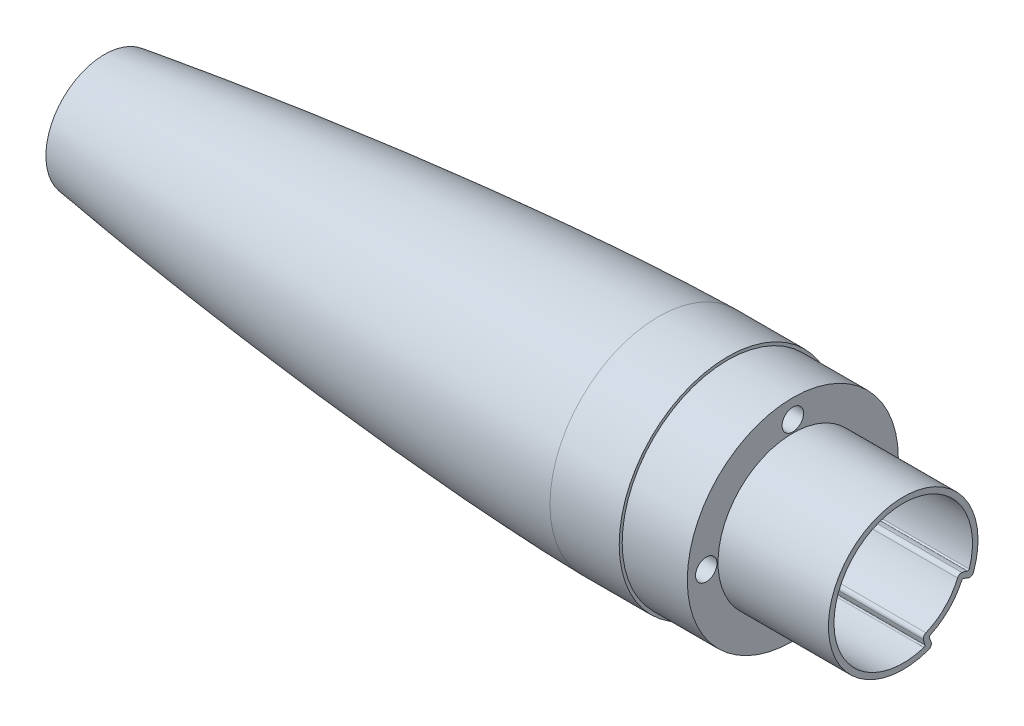
ISO-10303-21;
HEADER;
FILE_DESCRIPTION(('STEP AP214'),'2;1');
FILE_NAME('part.step','',(''),(''),'','','');
FILE_SCHEMA(('AUTOMOTIVE_DESIGN { 1 0 10303 214 1 1 1 1 }'));
ENDSEC;
DATA;
#1=APPLICATION_CONTEXT('core data for automotive mechanical design processes');
#2=APPLICATION_PROTOCOL_DEFINITION('international standard','automotive_design',2000,#1);
#3=PRODUCT_CONTEXT('',#1,'mechanical');
#4=PRODUCT('Part','Part','',(#3));
#5=PRODUCT_RELATED_PRODUCT_CATEGORY('part','',(#4));
#6=PRODUCT_DEFINITION_FORMATION('','',#4);
#7=PRODUCT_DEFINITION_CONTEXT('part definition',#1,'design');
#8=PRODUCT_DEFINITION('design','',#6,#7);
#9=PRODUCT_DEFINITION_SHAPE('','',#8);
#10=(LENGTH_UNIT() NAMED_UNIT(*) SI_UNIT(.MILLI.,.METRE.));
#11=(NAMED_UNIT(*) PLANE_ANGLE_UNIT() SI_UNIT($,.RADIAN.));
#12=(NAMED_UNIT(*) SI_UNIT($,.STERADIAN.) SOLID_ANGLE_UNIT());
#13=UNCERTAINTY_MEASURE_WITH_UNIT(LENGTH_MEASURE(1.E-05),#10,'distance_accuracy_value','');
#14=(GEOMETRIC_REPRESENTATION_CONTEXT(3) GLOBAL_UNCERTAINTY_ASSIGNED_CONTEXT((#13)) GLOBAL_UNIT_ASSIGNED_CONTEXT((#10,
#11,#12)) REPRESENTATION_CONTEXT('',''));
#15=CARTESIAN_POINT('',(0.,0.,0.));
#16=DIRECTION('',(0.,0.,1.));
#17=DIRECTION('',(1.,0.,0.));
#18=AXIS2_PLACEMENT_3D('',#15,#16,#17);
#19=CARTESIAN_POINT('',(526.458884211245,0.,0.));
#20=DIRECTION('',(1.,0.,0.));
#21=DIRECTION('',(0.,0.,-1.));
#22=AXIS2_PLACEMENT_3D('',#19,#20,#21);
#23=CYLINDRICAL_SURFACE('',#22,54.);
#24=CARTESIAN_POINT('',(650.,0.,0.));
#25=DIRECTION('',(-1.,0.,0.));
#26=DIRECTION('',(0.,0.,1.));
#27=AXIS2_PLACEMENT_3D('',#24,#25,#26);
#28=CIRCLE('',#27,54.);
#29=CARTESIAN_POINT('',(650.,-21.6673240024241,-49.4623803569337));
#30=VERTEX_POINT('',#29);
#31=CARTESIAN_POINT('',(650.,-49.4623803569334,-21.6673240024246));
#32=VERTEX_POINT('',#31);
#33=EDGE_CURVE('E172',#30,#32,#28,.T.);
#34=ORIENTED_EDGE('',*,*,#33,.T.);
#35=DIRECTION('',(1.,0.,0.));
#36=VECTOR('',#35,1.);
#37=CARTESIAN_POINT('',(526.458884211245,-49.4623803569334,-21.6673240024246));
#38=LINE('',#37,#36);
#39=CARTESIAN_POINT('',(697.,-49.4623803569334,-21.6673240024246));
#40=VERTEX_POINT('',#39);
#41=EDGE_CURVE('E180',#32,#40,#38,.T.);
#42=ORIENTED_EDGE('',*,*,#41,.T.);
#43=CARTESIAN_POINT('',(697.,0.,0.));
#44=DIRECTION('',(1.,0.,0.));
#45=DIRECTION('',(0.,0.,-1.));
#46=AXIS2_PLACEMENT_3D('',#43,#44,#45);
#47=CIRCLE('',#46,54.);
#48=CARTESIAN_POINT('',(697.,-21.6673240024241,-49.4623803569337));
#49=VERTEX_POINT('',#48);
#50=EDGE_CURVE('E419',#40,#49,#47,.T.);
#51=ORIENTED_EDGE('',*,*,#50,.T.);
#52=DIRECTION('',(1.,0.,0.));
#53=VECTOR('',#52,1.);
#54=CARTESIAN_POINT('',(526.458884211245,-21.6673240024241,-49.4623803569337));
#55=LINE('',#54,#53);
#56=EDGE_CURVE('E182',#30,#49,#55,.T.);
#57=ORIENTED_EDGE('',*,*,#56,.F.);
#58=EDGE_LOOP('',(#34,#42,#51,#57));
#59=FACE_BOUND('',#58,.T.);
#60=ADVANCED_FACE('F44',(#59),#23,.F.);
#61=CARTESIAN_POINT('',(776.72,0.,0.));
#62=DIRECTION('',(-1.,0.,0.));
#63=DIRECTION('',(0.,0.,1.));
#64=AXIS2_PLACEMENT_3D('',#61,#62,#63);
#65=PLANE('',#64);
#66=CARTESIAN_POINT('',(776.72,0.,0.));
#67=DIRECTION('',(1.,0.,0.));
#68=DIRECTION('',(0.,0.,-1.));
#69=AXIS2_PLACEMENT_3D('',#66,#67,#68);
#70=CIRCLE('',#69,54.);
#71=CARTESIAN_POINT('',(776.72,-18.3832569477305,-50.774559220083));
#72=VERTEX_POINT('',#71);
#73=CARTESIAN_POINT('',(776.72,-50.7745592200828,-18.3832569477311));
#74=VERTEX_POINT('',#73);
#75=EDGE_CURVE('E493',#72,#74,#70,.T.);
#76=ORIENTED_EDGE('',*,*,#75,.T.);
#77=CARTESIAN_POINT('',(776.72,-47.9537503745227,-17.3619648950793));
#78=DIRECTION('',(-1.,0.,0.));
#79=DIRECTION('',(0.,0.,1.));
#80=AXIS2_PLACEMENT_3D('',#77,#78,#79);
#81=CIRCLE('',#80,3.);
#82=CARTESIAN_POINT('',(776.72,-46.679404610551,-20.0778520197308));
#83=VERTEX_POINT('',#82);
#84=EDGE_CURVE('E426',#74,#83,#81,.F.);
#85=ORIENTED_EDGE('',*,*,#84,.T.);
#86=CARTESIAN_POINT('',(776.72,-38.1837661840734,-38.1837661840738));
#87=DIRECTION('',(1.,0.,0.));
#88=DIRECTION('',(0.,0.,-1.));
#89=AXIS2_PLACEMENT_3D('',#86,#87,#88);
#90=CIRCLE('',#89,20.);
#91=CARTESIAN_POINT('',(776.72,-43.4171482078619,-18.8806132656232));
#92=VERTEX_POINT('',#91);
#93=EDGE_CURVE('E484',#92,#83,#90,.T.);
#94=ORIENTED_EDGE('',*,*,#93,.F.);
#95=CARTESIAN_POINT('',(776.72,-43.1554791066725,-19.8457709115457));
#96=DIRECTION('',(-1.,0.,0.));
#97=DIRECTION('',(0.,0.,1.));
#98=AXIS2_PLACEMENT_3D('',#95,#96,#97);
#99=CIRCLE('',#98,1.);
#100=CARTESIAN_POINT('',(776.72,-42.2469427044268,-19.4279652081448));
#101=VERTEX_POINT('',#100);
#102=EDGE_CURVE('E14',#92,#101,#99,.T.);
#103=ORIENTED_EDGE('',*,*,#102,.T.);
#104=CARTESIAN_POINT('',(776.72,0.,0.));
#105=DIRECTION('',(1.,0.,0.));
#106=DIRECTION('',(0.,0.,-1.));
#107=AXIS2_PLACEMENT_3D('',#104,#105,#106);
#108=CIRCLE('',#107,46.5);
#109=CARTESIAN_POINT('',(776.72,-19.4279652081443,-42.2469427044269));
#110=VERTEX_POINT('',#109);
#111=EDGE_CURVE('E190',#101,#110,#108,.T.);
#112=ORIENTED_EDGE('',*,*,#111,.T.);
#113=CARTESIAN_POINT('',(776.72,-19.8457709115453,-43.1554791066727));
#114=DIRECTION('',(-1.,0.,0.));
#115=DIRECTION('',(0.,0.,1.));
#116=AXIS2_PLACEMENT_3D('',#113,#114,#115);
#117=CIRCLE('',#116,1.);
#118=CARTESIAN_POINT('',(776.72,-18.8806132656227,-43.4171482078621));
#119=VERTEX_POINT('',#118);
#120=EDGE_CURVE('E52',#110,#119,#117,.T.);
#121=ORIENTED_EDGE('',*,*,#120,.T.);
#122=CARTESIAN_POINT('',(776.72,-20.0778520197303,-46.6794046105512));
#123=VERTEX_POINT('',#122);
#124=EDGE_CURVE('E192',#123,#119,#90,.T.);
#125=ORIENTED_EDGE('',*,*,#124,.F.);
#126=CARTESIAN_POINT('',(776.72,-17.3619648950788,-47.9537503745229));
#127=DIRECTION('',(-1.,0.,0.));
#128=DIRECTION('',(0.,0.,1.));
#129=AXIS2_PLACEMENT_3D('',#126,#127,#128);
#130=CIRCLE('',#129,3.);
#131=EDGE_CURVE('E495',#123,#72,#130,.F.);
#132=ORIENTED_EDGE('',*,*,#131,.T.);
#133=EDGE_LOOP('',(#76,#85,#94,#103,#112,#121,#125,#132));
#134=FACE_BOUND('',#133,.T.);
#135=CARTESIAN_POINT('',(776.72,0.,0.));
#136=DIRECTION('',(1.,0.,0.));
#137=DIRECTION('',(0.,0.,-1.));
#138=AXIS2_PLACEMENT_3D('',#135,#136,#137);
#139=CIRCLE('',#138,42.5);
#140=CARTESIAN_POINT('',(776.72,-39.2186752694362,-16.3751491630005));
#141=VERTEX_POINT('',#140);
#142=CARTESIAN_POINT('',(776.72,-16.3751491630001,-39.2186752694364));
#143=VERTEX_POINT('',#142);
#144=EDGE_CURVE('E253',#141,#143,#139,.T.);
#145=ORIENTED_EDGE('',*,*,#144,.F.);
#146=CARTESIAN_POINT('',(776.72,-41.9870523472787,-17.5310420450947));
#147=DIRECTION('',(-1.,0.,0.));
#148=DIRECTION('',(0.,0.,1.));
#149=AXIS2_PLACEMENT_3D('',#146,#147,#148);
#150=CIRCLE('',#149,3.);
#151=CARTESIAN_POINT('',(776.72,-42.5303789420224,-14.5806528823834));
#152=VERTEX_POINT('',#151);
#153=EDGE_CURVE('E497',#141,#152,#150,.F.);
#154=ORIENTED_EDGE('',*,*,#153,.T.);
#155=CARTESIAN_POINT('',(776.72,-38.1837661840734,-38.1837661840738));
#156=DIRECTION('',(1.,0.,0.));
#157=DIRECTION('',(0.,0.,-1.));
#158=AXIS2_PLACEMENT_3D('',#155,#156,#157);
#159=CIRCLE('',#158,24.);
#160=CARTESIAN_POINT('',(776.72,-46.4021029100295,-15.6347320260704));
#161=VERTEX_POINT('',#160);
#162=EDGE_CURVE('E236',#152,#161,#159,.T.);
#163=ORIENTED_EDGE('',*,*,#162,.T.);
#164=CARTESIAN_POINT('',(776.72,-46.7445336069443,-14.6951889361536));
#165=DIRECTION('',(-1.,0.,0.));
#166=DIRECTION('',(0.,0.,1.));
#167=AXIS2_PLACEMENT_3D('',#164,#165,#166);
#168=CIRCLE('',#167,1.);
#169=CARTESIAN_POINT('',(776.72,-47.6985036805554,-14.9950907511772));
#170=VERTEX_POINT('',#169);
#171=EDGE_CURVE('E477',#161,#170,#168,.T.);
#172=ORIENTED_EDGE('',*,*,#171,.T.);
#173=CARTESIAN_POINT('',(776.72,0.,0.));
#174=DIRECTION('',(1.,0.,0.));
#175=DIRECTION('',(0.,0.,-1.));
#176=AXIS2_PLACEMENT_3D('',#173,#174,#175);
#177=CIRCLE('',#176,50.);
#178=CARTESIAN_POINT('',(776.72,-14.9950907511766,-47.6985036805556));
#179=VERTEX_POINT('',#178);
#180=EDGE_CURVE('E243',#179,#170,#177,.T.);
#181=ORIENTED_EDGE('',*,*,#180,.F.);
#182=CARTESIAN_POINT('',(776.72,-14.6951889361531,-46.7445336069445));
#183=DIRECTION('',(-1.,0.,0.));
#184=DIRECTION('',(0.,0.,1.));
#185=AXIS2_PLACEMENT_3D('',#182,#183,#184);
#186=CIRCLE('',#185,1.);
#187=CARTESIAN_POINT('',(776.72,-15.6347320260699,-46.4021029100297));
#188=VERTEX_POINT('',#187);
#189=EDGE_CURVE('E475',#179,#188,#186,.T.);
#190=ORIENTED_EDGE('',*,*,#189,.T.);
#191=CARTESIAN_POINT('',(776.72,-14.5806528823829,-42.5303789420225));
#192=VERTEX_POINT('',#191);
#193=EDGE_CURVE('E254',#188,#192,#159,.T.);
#194=ORIENTED_EDGE('',*,*,#193,.T.);
#195=CARTESIAN_POINT('',(776.72,-17.5310420450942,-41.9870523472789));
#196=DIRECTION('',(-1.,0.,0.));
#197=DIRECTION('',(0.,0.,1.));
#198=AXIS2_PLACEMENT_3D('',#195,#196,#197);
#199=CIRCLE('',#198,3.);
#200=EDGE_CURVE('E494',#192,#143,#199,.F.);
#201=ORIENTED_EDGE('',*,*,#200,.T.);
#202=EDGE_LOOP('',(#145,#154,#163,#172,#181,#190,#194,#201));
#203=FACE_BOUND('',#202,.T.);
#204=ADVANCED_FACE('F273',(#134,#203),#65,.F.);
#205=CARTESIAN_POINT('',(0.,0.,0.));
#206=CARTESIAN_POINT('',(0.0016487257899739,0.00637767165344409,0.));
#207=CARTESIAN_POINT('',(0.0057621718653015,0.0188021593914274,0.));
#208=CARTESIAN_POINT('',(0.0175123313243743,0.0422493817570645,0.));
#209=CARTESIAN_POINT('',(0.046253840596632,0.0861642592508907,0.));
#210=CARTESIAN_POINT('',(0.0914748777391001,0.142292386652359,0.));
#211=CARTESIAN_POINT('',(0.154274348482774,0.20912514537751,0.));
#212=CARTESIAN_POINT('',(0.276301441633623,0.324701770965458,0.));
#213=CARTESIAN_POINT('',(0.421122579930573,0.443291574190418,0.));
#214=CARTESIAN_POINT('',(0.586286455480629,0.566464418607899,0.));
#215=CARTESIAN_POINT('',(0.83951343193514,0.741034702086761,0.));
#216=CARTESIAN_POINT('',(1.18296840036321,0.960203667032714,0.));
#217=CARTESIAN_POINT('',(1.78280966033623,1.30866238394851,0.));
#218=CARTESIAN_POINT('',(2.86829695281267,1.87162382715185,0.));
#219=CARTESIAN_POINT('',(4.76277782522134,2.73974077748204,0.));
#220=CARTESIAN_POINT('',(8.19028565992219,4.11595910205271,0.));
#221=CARTESIAN_POINT('',(14.422968110472,6.28797056713511,0.));
#222=CARTESIAN_POINT('',(24.8043027546662,9.40768115367406,0.));
#223=CARTESIAN_POINT('',(38.8994962833824,13.087626071966,0.));
#224=CARTESIAN_POINT('',(55.9277376029872,17.0568128067629,0.));
#225=CARTESIAN_POINT('',(79.0908104498615,21.9783504080432,0.));
#226=CARTESIAN_POINT('',(106.881185800737,27.3295948783205,0.));
#227=CARTESIAN_POINT('',(139.404169497215,33.0214355719504,0.));
#228=CARTESIAN_POINT('',(176.668348452349,38.9538903494959,0.));
#229=CARTESIAN_POINT('',(214.003857084132,44.4168991341357,0.));
#230=CARTESIAN_POINT('',(251.396751983993,49.471116429039,0.));
#231=CARTESIAN_POINT('',(288.837779512109,54.1545255374062,0.));
#232=CARTESIAN_POINT('',(326.320734140861,58.4892815739677,0.));
#233=CARTESIAN_POINT('',(363.841177132752,62.4863121261995,0.));
#234=CARTESIAN_POINT('',(401.39599420768,66.1465092198773,0.));
#235=CARTESIAN_POINT('',(438.982971251084,69.4606087355129,0.));
#236=CARTESIAN_POINT('',(476.600652970697,72.4071093826599,0.));
#237=CARTESIAN_POINT('',(509.542265690245,74.6286978107565,0.));
#238=CARTESIAN_POINT('',(537.796481138977,76.2335046528282,0.));
#239=CARTESIAN_POINT('',(560.292262180115,77.2754594007759,0.));
#240=CARTESIAN_POINT('',(575.19535670378,77.8326432804356,0.));
#241=CARTESIAN_POINT('',(587.214225045065,78.1730067265653,0.));
#242=CARTESIAN_POINT('',(594.51997618939,78.3103558818441,0.));
#243=CARTESIAN_POINT('',(598.173256760109,78.3543246601118,0.));
#244=CARTESIAN_POINT('',(600.,78.36,0.));
#245=B_SPLINE_CURVE_WITH_KNOTS('',4,(#205,#206,#207,#208,#209,#210,#211,#212,#213,#214,#215,
#216,#217,#218,#219,#220,#221,#222,#223,#224,#225,#226,#227,#228,#229,#230,#231,#232,#233,#234,
#235,#236,#237,#238,#239,#240,#241,#242,#243,#244),.UNSPECIFIED.,.F.,.F.,(5,1,1,1,1,1,1,1,1,1,1,
1,1,1,1,1,1,1,1,1,1,1,1,1,1,1,1,1,1,1,1,1,1,1,1,1,5),(0.,4.31412316187256E-05,
8.62824632374512E-05,0.000172564926474902,0.000345129852949805,0.000517694779424707,
0.000690259705899609,0.00127990506767294,0.00157768305463857,0.0018754610416042,
0.00271726976481212,0.00396472959905857,0.00614862348380284,0.00993227852523749,
0.0164479418553174,0.028301298247299,0.0496396283350756,0.0813631631901833,0.112451510280435,
0.143539857370687,0.20571657333025,0.267893284077703,0.330069994858809,0.392246705900878,
0.454423416608389,0.516600127206857,0.578776840412764,0.640953551735382,0.703130263297214,
0.765306975424274,0.827483686980578,0.889660398581477,0.920748754835595,0.951837111089712,
0.975918555544856,0.987959277772428,1.),.UNSPECIFIED.);
#246=CARTESIAN_POINT('',(776.72,0.,0.));
#247=DIRECTION('',(1.,0.,0.));
#248=AXIS1_PLACEMENT('',#246,#247);
#249=SURFACE_OF_REVOLUTION('',#245,#248);
#250=CARTESIAN_POINT('',(600.,0.,0.));
#251=DIRECTION('',(1.,0.,0.));
#252=DIRECTION('',(0.,0.,-1.));
#253=AXIS2_PLACEMENT_3D('',#250,#251,#252);
#254=CIRCLE('',#253,78.36);
#255=CARTESIAN_POINT('',(600.,0.,-78.36));
#256=VERTEX_POINT('',#255);
#257=EDGE_CURVE('E250',#256,#256,#254,.T.);
#258=ORIENTED_EDGE('',*,*,#257,.F.);
#259=EDGE_LOOP('',(#258));
#260=FACE_BOUND('',#259,.T.);
#261=CARTESIAN_POINT('',(200.000000000004,0.,0.));
#262=DIRECTION('',(1.,0.,0.));
#263=DIRECTION('',(0.,0.,-1.));
#264=AXIS2_PLACEMENT_3D('',#261,#262,#263);
#265=CIRCLE('',#264,42.3282803701014);
#266=CARTESIAN_POINT('',(200.000000000004,0.,-42.3282803701014));
#267=VERTEX_POINT('',#266);
#268=EDGE_CURVE('E519',#267,#267,#265,.T.);
#269=ORIENTED_EDGE('',*,*,#268,.T.);
#270=EDGE_LOOP('',(#269));
#271=FACE_BOUND('',#270,.T.);
#272=ADVANCED_FACE('F268',(#260,#271),#249,.T.);
#273=CARTESIAN_POINT('',(200.000000000003,-1.70487664440081E-11,0.));
#274=DIRECTION('',(1.,0.,0.));
#275=DIRECTION('',(0.,0.,-1.));
#276=AXIS2_PLACEMENT_3D('',#273,#274,#275);
#277=PLANE('',#276);
#278=CARTESIAN_POINT('',(200.000000000003,0.,0.));
#279=DIRECTION('',(-1.,0.,0.));
#280=DIRECTION('',(0.,0.,1.));
#281=AXIS2_PLACEMENT_3D('',#278,#279,#280);
#282=CIRCLE('',#281,33.);
#283=CARTESIAN_POINT('',(200.000000000003,0.,33.));
#284=VERTEX_POINT('',#283);
#285=EDGE_CURVE('E232',#284,#284,#282,.T.);
#286=ORIENTED_EDGE('',*,*,#285,.F.);
#287=EDGE_LOOP('',(#286));
#288=FACE_BOUND('',#287,.T.);
#289=ORIENTED_EDGE('',*,*,#268,.F.);
#290=EDGE_LOOP('',(#289));
#291=FACE_BOUND('',#290,.T.);
#292=ADVANCED_FACE('F272',(#288,#291),#277,.F.);
#293=CARTESIAN_POINT('',(776.72,0.,0.));
#294=DIRECTION('',(1.,0.,0.));
#295=DIRECTION('',(0.,0.,-1.));
#296=AXIS2_PLACEMENT_3D('',#293,#294,#295);
#297=CYLINDRICAL_SURFACE('',#296,54.);
#298=CARTESIAN_POINT('',(697.,-18.3832569477305,-50.774559220083));
#299=VERTEX_POINT('',#298);
#300=CARTESIAN_POINT('',(697.,-50.7745592200828,-18.3832569477311));
#301=VERTEX_POINT('',#300);
#302=EDGE_CURVE('E410',#299,#301,#47,.T.);
#303=ORIENTED_EDGE('',*,*,#302,.T.);
#304=DIRECTION('',(1.,0.,0.));
#305=VECTOR('',#304,1.);
#306=CARTESIAN_POINT('',(776.72,-50.7745592200828,-18.3832569477311));
#307=LINE('',#306,#305);
#308=EDGE_CURVE('E413',#301,#74,#307,.T.);
#309=ORIENTED_EDGE('',*,*,#308,.T.);
#310=ORIENTED_EDGE('',*,*,#75,.F.);
#311=DIRECTION('',(1.,0.,0.));
#312=VECTOR('',#311,1.);
#313=CARTESIAN_POINT('',(776.72,-18.3832569477305,-50.774559220083));
#314=LINE('',#313,#312);
#315=EDGE_CURVE('E416',#72,#299,#314,.F.);
#316=ORIENTED_EDGE('',*,*,#315,.T.);
#317=EDGE_LOOP('',(#303,#309,#310,#316));
#318=FACE_BOUND('',#317,.T.);
#319=ADVANCED_FACE('F399',(#318),#297,.T.);
#320=CARTESIAN_POINT('',(697.,0.,0.));
#321=DIRECTION('',(-1.,0.,0.));
#322=DIRECTION('',(0.,0.,1.));
#323=AXIS2_PLACEMENT_3D('',#320,#321,#322);
#324=PLANE('',#323);
#325=CARTESIAN_POINT('',(697.,62.5,0.));
#326=DIRECTION('',(1.,0.,0.));
#327=DIRECTION('',(0.,0.,-1.));
#328=AXIS2_PLACEMENT_3D('',#325,#326,#327);
#329=CIRCLE('',#328,7.75);
#330=CARTESIAN_POINT('',(697.,62.5,-7.75));
#331=VERTEX_POINT('',#330);
#332=EDGE_CURVE('E200',#331,#331,#329,.T.);
#333=ORIENTED_EDGE('',*,*,#332,.F.);
#334=EDGE_LOOP('',(#333));
#335=FACE_BOUND('',#334,.T.);
#336=CARTESIAN_POINT('',(697.,-2.18249897321332E-13,-62.5));
#337=DIRECTION('',(1.,0.,0.));
#338=DIRECTION('',(0.,0.,-1.));
#339=AXIS2_PLACEMENT_3D('',#336,#337,#338);
#340=CIRCLE('',#339,7.75);
#341=CARTESIAN_POINT('',(697.,-2.18249897321332E-13,-70.25));
#342=VERTEX_POINT('',#341);
#343=EDGE_CURVE('E203',#342,#342,#340,.T.);
#344=ORIENTED_EDGE('',*,*,#343,.F.);
#345=EDGE_LOOP('',(#344));
#346=FACE_BOUND('',#345,.T.);
#347=CARTESIAN_POINT('',(697.,-62.5,4.37150315946155E-13));
#348=DIRECTION('',(1.,0.,0.));
#349=DIRECTION('',(0.,0.,-1.));
#350=AXIS2_PLACEMENT_3D('',#347,#348,#349);
#351=CIRCLE('',#350,7.75);
#352=CARTESIAN_POINT('',(697.,-62.5,-7.74999999999956));
#353=VERTEX_POINT('',#352);
#354=EDGE_CURVE('E209',#353,#353,#351,.T.);
#355=ORIENTED_EDGE('',*,*,#354,.F.);
#356=EDGE_LOOP('',(#355));
#357=FACE_BOUND('',#356,.T.);
#358=CARTESIAN_POINT('',(697.,6.55725473919233E-13,62.5));
#359=DIRECTION('',(1.,0.,0.));
#360=DIRECTION('',(0.,0.,-1.));
#361=AXIS2_PLACEMENT_3D('',#358,#359,#360);
#362=CIRCLE('',#361,7.75);
#363=CARTESIAN_POINT('',(697.,6.55725473919233E-13,54.75));
#364=VERTEX_POINT('',#363);
#365=EDGE_CURVE('E215',#364,#364,#362,.T.);
#366=ORIENTED_EDGE('',*,*,#365,.F.);
#367=EDGE_LOOP('',(#366));
#368=FACE_BOUND('',#367,.T.);
#369=ORIENTED_EDGE('',*,*,#50,.F.);
#370=CARTESIAN_POINT('',(697.,-38.1837661840734,-38.1837661840738));
#371=DIRECTION('',(-1.,0.,0.));
#372=DIRECTION('',(0.,0.,1.));
#373=AXIS2_PLACEMENT_3D('',#370,#371,#372);
#374=CIRCLE('',#373,20.);
#375=CARTESIAN_POINT('',(697.,-46.679404610551,-20.0778520197308));
#376=VERTEX_POINT('',#375);
#377=EDGE_CURVE('E187',#376,#40,#374,.F.);
#378=ORIENTED_EDGE('',*,*,#377,.F.);
#379=CARTESIAN_POINT('',(697.,-47.9537503745227,-17.3619648950793));
#380=DIRECTION('',(-1.,0.,0.));
#381=DIRECTION('',(0.,0.,1.));
#382=AXIS2_PLACEMENT_3D('',#379,#380,#381);
#383=CIRCLE('',#382,3.);
#384=EDGE_CURVE('E424',#376,#301,#383,.T.);
#385=ORIENTED_EDGE('',*,*,#384,.T.);
#386=ORIENTED_EDGE('',*,*,#302,.F.);
#387=CARTESIAN_POINT('',(697.,-17.3619648950788,-47.9537503745229));
#388=DIRECTION('',(-1.,0.,0.));
#389=DIRECTION('',(0.,0.,1.));
#390=AXIS2_PLACEMENT_3D('',#387,#388,#389);
#391=CIRCLE('',#390,3.);
#392=CARTESIAN_POINT('',(697.,-20.0778520197303,-46.6794046105512));
#393=VERTEX_POINT('',#392);
#394=EDGE_CURVE('E447',#299,#393,#391,.T.);
#395=ORIENTED_EDGE('',*,*,#394,.T.);
#396=CARTESIAN_POINT('',(697.,-38.1837661840734,-38.1837661840738));
#397=DIRECTION('',(-1.,0.,0.));
#398=DIRECTION('',(0.,0.,1.));
#399=AXIS2_PLACEMENT_3D('',#396,#397,#398);
#400=CIRCLE('',#399,20.);
#401=EDGE_CURVE('E427',#49,#393,#400,.F.);
#402=ORIENTED_EDGE('',*,*,#401,.F.);
#403=EDGE_LOOP('',(#369,#378,#385,#386,#395,#402));
#404=FACE_BOUND('',#403,.T.);
#405=CARTESIAN_POINT('',(697.,0.,0.));
#406=DIRECTION('',(1.,0.,0.));
#407=DIRECTION('',(0.,0.,-1.));
#408=AXIS2_PLACEMENT_3D('',#405,#406,#407);
#409=CIRCLE('',#408,76.2);
#410=CARTESIAN_POINT('',(697.,0.,-76.2));
#411=VERTEX_POINT('',#410);
#412=EDGE_CURVE('E420',#411,#411,#409,.T.);
#413=ORIENTED_EDGE('',*,*,#412,.T.);
#414=EDGE_LOOP('',(#413));
#415=FACE_BOUND('',#414,.T.);
#416=ADVANCED_FACE('F395',(#335,#346,#357,#368,#404,#415),#324,.F.);
#417=CARTESIAN_POINT('',(776.72,0.,0.));
#418=DIRECTION('',(1.,0.,0.));
#419=DIRECTION('',(0.,0.,-1.));
#420=AXIS2_PLACEMENT_3D('',#417,#418,#419);
#421=CYLINDRICAL_SURFACE('',#420,76.2);
#422=ORIENTED_EDGE('',*,*,#412,.F.);
#423=EDGE_LOOP('',(#422));
#424=FACE_BOUND('',#423,.T.);
#425=CARTESIAN_POINT('',(650.,0.,0.));
#426=DIRECTION('',(1.,0.,0.));
#427=DIRECTION('',(0.,0.,-1.));
#428=AXIS2_PLACEMENT_3D('',#425,#426,#427);
#429=CIRCLE('',#428,76.2);
#430=CARTESIAN_POINT('',(650.,0.,-76.2));
#431=VERTEX_POINT('',#430);
#432=EDGE_CURVE('E527',#431,#431,#429,.T.);
#433=ORIENTED_EDGE('',*,*,#432,.T.);
#434=EDGE_LOOP('',(#433));
#435=FACE_BOUND('',#434,.T.);
#436=ADVANCED_FACE('F391',(#424,#435),#421,.T.);
#437=CARTESIAN_POINT('',(650.,0.,0.));
#438=DIRECTION('',(-1.,0.,0.));
#439=DIRECTION('',(0.,0.,1.));
#440=AXIS2_PLACEMENT_3D('',#437,#438,#439);
#441=PLANE('',#440);
#442=ORIENTED_EDGE('',*,*,#432,.F.);
#443=EDGE_LOOP('',(#442));
#444=FACE_BOUND('',#443,.T.);
#445=CARTESIAN_POINT('',(650.,0.,0.));
#446=DIRECTION('',(1.,0.,0.));
#447=DIRECTION('',(0.,0.,-1.));
#448=AXIS2_PLACEMENT_3D('',#445,#446,#447);
#449=CIRCLE('',#448,78.36);
#450=CARTESIAN_POINT('',(650.,0.,-78.36));
#451=VERTEX_POINT('',#450);
#452=EDGE_CURVE('E529',#451,#451,#449,.T.);
#453=ORIENTED_EDGE('',*,*,#452,.T.);
#454=EDGE_LOOP('',(#453));
#455=FACE_BOUND('',#454,.T.);
#456=ADVANCED_FACE('F387',(#444,#455),#441,.F.);
#457=CARTESIAN_POINT('',(776.72,0.,0.));
#458=DIRECTION('',(1.,0.,0.));
#459=DIRECTION('',(0.,0.,-1.));
#460=AXIS2_PLACEMENT_3D('',#457,#458,#459);
#461=CYLINDRICAL_SURFACE('',#460,78.36);
#462=ORIENTED_EDGE('',*,*,#452,.F.);
#463=EDGE_LOOP('',(#462));
#464=FACE_BOUND('',#463,.T.);
#465=ORIENTED_EDGE('',*,*,#257,.T.);
#466=EDGE_LOOP('',(#465));
#467=FACE_BOUND('',#466,.T.);
#468=ADVANCED_FACE('F384',(#464,#467),#461,.T.);
#469=CARTESIAN_POINT('',(376.72,-38.1837661840734,-38.1837661840738));
#470=DIRECTION('',(1.,0.,0.));
#471=DIRECTION('',(0.,0.,-1.));
#472=AXIS2_PLACEMENT_3D('',#469,#470,#471);
#473=CYLINDRICAL_SURFACE('',#472,24.);
#474=CARTESIAN_POINT('',(376.72,-38.1837661840734,-38.1837661840738));
#475=DIRECTION('',(1.,0.,0.));
#476=DIRECTION('',(0.,0.,-1.));
#477=AXIS2_PLACEMENT_3D('',#474,#475,#476);
#478=CIRCLE('',#477,24.);
#479=CARTESIAN_POINT('',(376.72,-42.5303789420224,-14.5806528823834));
#480=VERTEX_POINT('',#479);
#481=CARTESIAN_POINT('',(376.72,-46.4021029100295,-15.6347320260704));
#482=VERTEX_POINT('',#481);
#483=EDGE_CURVE('E239',#480,#482,#478,.T.);
#484=ORIENTED_EDGE('',*,*,#483,.T.);
#485=DIRECTION('',(1.,0.,0.));
#486=VECTOR('',#485,1.);
#487=CARTESIAN_POINT('',(376.72,-46.4021029100295,-15.6347320260704));
#488=LINE('',#487,#486);
#489=EDGE_CURVE('E460',#482,#161,#488,.T.);
#490=ORIENTED_EDGE('',*,*,#489,.T.);
#491=ORIENTED_EDGE('',*,*,#162,.F.);
#492=DIRECTION('',(1.,0.,0.));
#493=VECTOR('',#492,1.);
#494=CARTESIAN_POINT('',(376.72,-42.5303789420224,-14.5806528823834));
#495=LINE('',#494,#493);
#496=EDGE_CURVE('E504',#152,#480,#495,.F.);
#497=ORIENTED_EDGE('',*,*,#496,.T.);
#498=EDGE_LOOP('',(#484,#490,#491,#497));
#499=FACE_BOUND('',#498,.T.);
#500=ADVANCED_FACE('F376',(#499),#473,.T.);
#501=CARTESIAN_POINT('',(376.72,0.,0.));
#502=DIRECTION('',(1.,0.,0.));
#503=DIRECTION('',(0.,0.,-1.));
#504=AXIS2_PLACEMENT_3D('',#501,#502,#503);
#505=CYLINDRICAL_SURFACE('',#504,50.);
#506=CARTESIAN_POINT('',(376.72,0.,0.));
#507=DIRECTION('',(1.,0.,0.));
#508=DIRECTION('',(0.,0.,-1.));
#509=AXIS2_PLACEMENT_3D('',#506,#507,#508);
#510=CIRCLE('',#509,50.);
#511=CARTESIAN_POINT('',(376.72,-14.9950907511766,-47.6985036805556));
#512=VERTEX_POINT('',#511);
#513=CARTESIAN_POINT('',(376.72,-47.6985036805554,-14.9950907511772));
#514=VERTEX_POINT('',#513);
#515=EDGE_CURVE('E247',#512,#514,#510,.T.);
#516=ORIENTED_EDGE('',*,*,#515,.F.);
#517=DIRECTION('',(1.,0.,0.));
#518=VECTOR('',#517,1.);
#519=CARTESIAN_POINT('',(376.72,-14.9950907511766,-47.6985036805556));
#520=LINE('',#519,#518);
#521=EDGE_CURVE('E451',#512,#179,#520,.T.);
#522=ORIENTED_EDGE('',*,*,#521,.T.);
#523=ORIENTED_EDGE('',*,*,#180,.T.);
#524=DIRECTION('',(1.,0.,0.));
#525=VECTOR('',#524,1.);
#526=CARTESIAN_POINT('',(376.72,-47.6985036805554,-14.9950907511772));
#527=LINE('',#526,#525);
#528=EDGE_CURVE('E449',#170,#514,#527,.F.);
#529=ORIENTED_EDGE('',*,*,#528,.T.);
#530=EDGE_LOOP('',(#516,#522,#523,#529));
#531=FACE_BOUND('',#530,.T.);
#532=ADVANCED_FACE('F372',(#531),#505,.F.);
#533=ORIENTED_EDGE('',*,*,#193,.F.);
#534=DIRECTION('',(1.,0.,0.));
#535=VECTOR('',#534,1.);
#536=CARTESIAN_POINT('',(376.72,-15.6347320260699,-46.4021029100297));
#537=LINE('',#536,#535);
#538=CARTESIAN_POINT('',(376.72,-15.6347320260699,-46.4021029100297));
#539=VERTEX_POINT('',#538);
#540=EDGE_CURVE('E454',#188,#539,#537,.F.);
#541=ORIENTED_EDGE('',*,*,#540,.T.);
#542=CARTESIAN_POINT('',(376.72,-14.5806528823829,-42.5303789420225));
#543=VERTEX_POINT('',#542);
#544=EDGE_CURVE('E244',#539,#543,#478,.T.);
#545=ORIENTED_EDGE('',*,*,#544,.T.);
#546=DIRECTION('',(1.,0.,0.));
#547=VECTOR('',#546,1.);
#548=CARTESIAN_POINT('',(376.72,-14.5806528823829,-42.5303789420225));
#549=LINE('',#548,#547);
#550=EDGE_CURVE('E432',#543,#192,#549,.T.);
#551=ORIENTED_EDGE('',*,*,#550,.T.);
#552=EDGE_LOOP('',(#533,#541,#545,#551));
#553=FACE_BOUND('',#552,.T.);
#554=ADVANCED_FACE('F375',(#553),#473,.T.);
#555=CARTESIAN_POINT('',(376.72,0.,0.));
#556=DIRECTION('',(1.,0.,0.));
#557=DIRECTION('',(0.,0.,-1.));
#558=AXIS2_PLACEMENT_3D('',#555,#556,#557);
#559=CYLINDRICAL_SURFACE('',#558,42.5);
#560=CARTESIAN_POINT('',(376.72,0.,0.));
#561=DIRECTION('',(1.,0.,0.));
#562=DIRECTION('',(0.,0.,-1.));
#563=AXIS2_PLACEMENT_3D('',#560,#561,#562);
#564=CIRCLE('',#563,42.5);
#565=CARTESIAN_POINT('',(376.72,-39.2186752694362,-16.3751491630005));
#566=VERTEX_POINT('',#565);
#567=CARTESIAN_POINT('',(376.72,-16.3751491630001,-39.2186752694364));
#568=VERTEX_POINT('',#567);
#569=EDGE_CURVE('E242',#566,#568,#564,.T.);
#570=ORIENTED_EDGE('',*,*,#569,.F.);
#571=DIRECTION('',(1.,0.,0.));
#572=VECTOR('',#571,1.);
#573=CARTESIAN_POINT('',(376.72,-39.2186752694362,-16.3751491630005));
#574=LINE('',#573,#572);
#575=EDGE_CURVE('E499',#566,#141,#574,.T.);
#576=ORIENTED_EDGE('',*,*,#575,.T.);
#577=ORIENTED_EDGE('',*,*,#144,.T.);
#578=DIRECTION('',(1.,0.,0.));
#579=VECTOR('',#578,1.);
#580=CARTESIAN_POINT('',(376.72,-16.3751491630001,-39.2186752694364));
#581=LINE('',#580,#579);
#582=EDGE_CURVE('E513',#143,#568,#581,.F.);
#583=ORIENTED_EDGE('',*,*,#582,.T.);
#584=EDGE_LOOP('',(#570,#576,#577,#583));
#585=FACE_BOUND('',#584,.T.);
#586=ADVANCED_FACE('F370',(#585),#559,.F.);
#587=CARTESIAN_POINT('',(376.72,0.,0.));
#588=DIRECTION('',(1.,0.,0.));
#589=DIRECTION('',(0.,0.,-1.));
#590=AXIS2_PLACEMENT_3D('',#587,#588,#589);
#591=PLANE('',#590);
#592=CARTESIAN_POINT('',(376.72,20.,0.));
#593=DIRECTION('',(1.,0.,0.));
#594=DIRECTION('',(0.,0.,-1.));
#595=AXIS2_PLACEMENT_3D('',#592,#593,#594);
#596=CIRCLE('',#595,3.1);
#597=CARTESIAN_POINT('',(376.72,20.,-3.1));
#598=VERTEX_POINT('',#597);
#599=EDGE_CURVE('E229',#598,#598,#596,.T.);
#600=ORIENTED_EDGE('',*,*,#599,.F.);
#601=EDGE_LOOP('',(#600));
#602=FACE_BOUND('',#601,.T.);
#603=CARTESIAN_POINT('',(376.72,-20.,0.));
#604=DIRECTION('',(1.,0.,0.));
#605=DIRECTION('',(0.,0.,-1.));
#606=AXIS2_PLACEMENT_3D('',#603,#604,#605);
#607=CIRCLE('',#606,3.1);
#608=CARTESIAN_POINT('',(376.72,-20.,-3.1));
#609=VERTEX_POINT('',#608);
#610=EDGE_CURVE('E223',#609,#609,#607,.T.);
#611=ORIENTED_EDGE('',*,*,#610,.F.);
#612=EDGE_LOOP('',(#611));
#613=FACE_BOUND('',#612,.T.);
#614=ORIENTED_EDGE('',*,*,#544,.F.);
#615=CARTESIAN_POINT('',(376.72,-14.6951889361531,-46.7445336069445));
#616=DIRECTION('',(1.,0.,0.));
#617=DIRECTION('',(0.,0.,-1.));
#618=AXIS2_PLACEMENT_3D('',#615,#616,#617);
#619=CIRCLE('',#618,1.);
#620=EDGE_CURVE('E458',#539,#512,#619,.T.);
#621=ORIENTED_EDGE('',*,*,#620,.T.);
#622=ORIENTED_EDGE('',*,*,#515,.T.);
#623=CARTESIAN_POINT('',(376.72,-46.7445336069443,-14.6951889361536));
#624=DIRECTION('',(1.,0.,0.));
#625=DIRECTION('',(0.,0.,-1.));
#626=AXIS2_PLACEMENT_3D('',#623,#624,#625);
#627=CIRCLE('',#626,1.);
#628=EDGE_CURVE('E456',#514,#482,#627,.T.);
#629=ORIENTED_EDGE('',*,*,#628,.T.);
#630=ORIENTED_EDGE('',*,*,#483,.F.);
#631=CARTESIAN_POINT('',(376.72,-41.9870523472787,-17.5310420450947));
#632=DIRECTION('',(1.,0.,0.));
#633=DIRECTION('',(0.,0.,-1.));
#634=AXIS2_PLACEMENT_3D('',#631,#632,#633);
#635=CIRCLE('',#634,3.);
#636=EDGE_CURVE('E441',#480,#566,#635,.F.);
#637=ORIENTED_EDGE('',*,*,#636,.T.);
#638=ORIENTED_EDGE('',*,*,#569,.T.);
#639=CARTESIAN_POINT('',(376.72,-17.5310420450942,-41.9870523472789));
#640=DIRECTION('',(1.,0.,0.));
#641=DIRECTION('',(0.,0.,-1.));
#642=AXIS2_PLACEMENT_3D('',#639,#640,#641);
#643=CIRCLE('',#642,3.);
#644=EDGE_CURVE('E443',#568,#543,#643,.F.);
#645=ORIENTED_EDGE('',*,*,#644,.T.);
#646=EDGE_LOOP('',(#614,#621,#622,#629,#630,#637,#638,#645));
#647=FACE_BOUND('',#646,.T.);
#648=ADVANCED_FACE('F366',(#602,#613,#647),#591,.T.);
#649=CARTESIAN_POINT('',(240.000000000003,0.,0.));
#650=DIRECTION('',(-1.,0.,0.));
#651=DIRECTION('',(0.,0.,1.));
#652=AXIS2_PLACEMENT_3D('',#649,#650,#651);
#653=CYLINDRICAL_SURFACE('',#652,33.);
#654=CARTESIAN_POINT('',(240.000000000003,0.,0.));
#655=DIRECTION('',(-1.,0.,0.));
#656=DIRECTION('',(0.,0.,1.));
#657=AXIS2_PLACEMENT_3D('',#654,#655,#656);
#658=CIRCLE('',#657,33.);
#659=CARTESIAN_POINT('',(240.000000000003,0.,33.));
#660=VERTEX_POINT('',#659);
#661=EDGE_CURVE('E233',#660,#660,#658,.T.);
#662=ORIENTED_EDGE('',*,*,#661,.F.);
#663=EDGE_LOOP('',(#662));
#664=FACE_BOUND('',#663,.T.);
#665=ORIENTED_EDGE('',*,*,#285,.T.);
#666=EDGE_LOOP('',(#665));
#667=FACE_BOUND('',#666,.T.);
#668=ADVANCED_FACE('F362',(#664,#667),#653,.F.);
#669=CARTESIAN_POINT('',(240.000000000003,0.,0.));
#670=DIRECTION('',(-1.,0.,0.));
#671=DIRECTION('',(0.,0.,1.));
#672=AXIS2_PLACEMENT_3D('',#669,#670,#671);
#673=PLANE('',#672);
#674=CARTESIAN_POINT('',(240.000000000003,-20.,0.));
#675=DIRECTION('',(-1.,0.,0.));
#676=DIRECTION('',(0.,0.,1.));
#677=AXIS2_PLACEMENT_3D('',#674,#675,#676);
#678=CIRCLE('',#677,3.1);
#679=CARTESIAN_POINT('',(240.000000000003,-20.,3.1));
#680=VERTEX_POINT('',#679);
#681=EDGE_CURVE('E199',#680,#680,#678,.T.);
#682=ORIENTED_EDGE('',*,*,#681,.F.);
#683=EDGE_LOOP('',(#682));
#684=FACE_BOUND('',#683,.T.);
#685=CARTESIAN_POINT('',(240.000000000003,20.,0.));
#686=DIRECTION('',(-1.,0.,0.));
#687=DIRECTION('',(0.,0.,1.));
#688=AXIS2_PLACEMENT_3D('',#685,#686,#687);
#689=CIRCLE('',#688,3.1);
#690=CARTESIAN_POINT('',(240.000000000003,20.,3.1));
#691=VERTEX_POINT('',#690);
#692=EDGE_CURVE('E226',#691,#691,#689,.T.);
#693=ORIENTED_EDGE('',*,*,#692,.F.);
#694=EDGE_LOOP('',(#693));
#695=FACE_BOUND('',#694,.T.);
#696=ORIENTED_EDGE('',*,*,#661,.T.);
#697=EDGE_LOOP('',(#696));
#698=FACE_BOUND('',#697,.T.);
#699=ADVANCED_FACE('F358',(#684,#695,#698),#673,.T.);
#700=CARTESIAN_POINT('',(776.72,-20.,0.));
#701=DIRECTION('',(-1.,0.,0.));
#702=DIRECTION('',(0.,0.,1.));
#703=AXIS2_PLACEMENT_3D('',#700,#701,#702);
#704=CYLINDRICAL_SURFACE('',#703,3.1);
#705=ORIENTED_EDGE('',*,*,#610,.T.);
#706=EDGE_LOOP('',(#705));
#707=FACE_BOUND('',#706,.T.);
#708=ORIENTED_EDGE('',*,*,#681,.T.);
#709=EDGE_LOOP('',(#708));
#710=FACE_BOUND('',#709,.T.);
#711=ADVANCED_FACE('F354',(#707,#710),#704,.F.);
#712=CARTESIAN_POINT('',(776.72,20.,0.));
#713=DIRECTION('',(-1.,0.,0.));
#714=DIRECTION('',(0.,0.,1.));
#715=AXIS2_PLACEMENT_3D('',#712,#713,#714);
#716=CYLINDRICAL_SURFACE('',#715,3.1);
#717=ORIENTED_EDGE('',*,*,#599,.T.);
#718=EDGE_LOOP('',(#717));
#719=FACE_BOUND('',#718,.T.);
#720=ORIENTED_EDGE('',*,*,#692,.T.);
#721=EDGE_LOOP('',(#720));
#722=FACE_BOUND('',#721,.T.);
#723=ADVANCED_FACE('F347',(#719,#722),#716,.F.);
#724=CARTESIAN_POINT('',(667.,6.55725473919233E-13,62.5));
#725=DIRECTION('',(1.,0.,0.));
#726=DIRECTION('',(0.,0.,-1.));
#727=AXIS2_PLACEMENT_3D('',#724,#725,#726);
#728=CYLINDRICAL_SURFACE('',#727,7.75);
#729=CARTESIAN_POINT('',(667.,6.55725473919233E-13,62.5));
#730=DIRECTION('',(1.,0.,0.));
#731=DIRECTION('',(0.,0.,-1.));
#732=AXIS2_PLACEMENT_3D('',#729,#730,#731);
#733=CIRCLE('',#732,7.75);
#734=CARTESIAN_POINT('',(667.,6.55725473919233E-13,54.75));
#735=VERTEX_POINT('',#734);
#736=EDGE_CURVE('E218',#735,#735,#733,.T.);
#737=ORIENTED_EDGE('',*,*,#736,.F.);
#738=EDGE_LOOP('',(#737));
#739=FACE_BOUND('',#738,.T.);
#740=ORIENTED_EDGE('',*,*,#365,.T.);
#741=EDGE_LOOP('',(#740));
#742=FACE_BOUND('',#741,.T.);
#743=ADVANCED_FACE('F344',(#739,#742),#728,.F.);
#744=CARTESIAN_POINT('',(667.,6.55725473919233E-13,62.5));
#745=DIRECTION('',(1.,0.,0.));
#746=DIRECTION('',(0.,0.,-1.));
#747=AXIS2_PLACEMENT_3D('',#744,#745,#746);
#748=PLANE('',#747);
#749=ORIENTED_EDGE('',*,*,#736,.T.);
#750=EDGE_LOOP('',(#749));
#751=FACE_BOUND('',#750,.T.);
#752=ADVANCED_FACE('F339',(#751),#748,.T.);
#753=CARTESIAN_POINT('',(667.,-62.5,4.37150315946155E-13));
#754=DIRECTION('',(1.,0.,0.));
#755=DIRECTION('',(0.,0.,-1.));
#756=AXIS2_PLACEMENT_3D('',#753,#754,#755);
#757=CYLINDRICAL_SURFACE('',#756,7.75);
#758=CARTESIAN_POINT('',(667.,-62.5,4.37150315946155E-13));
#759=DIRECTION('',(1.,0.,0.));
#760=DIRECTION('',(0.,0.,-1.));
#761=AXIS2_PLACEMENT_3D('',#758,#759,#760);
#762=CIRCLE('',#761,7.75);
#763=CARTESIAN_POINT('',(667.,-62.5,-7.74999999999956));
#764=VERTEX_POINT('',#763);
#765=EDGE_CURVE('E212',#764,#764,#762,.T.);
#766=ORIENTED_EDGE('',*,*,#765,.F.);
#767=EDGE_LOOP('',(#766));
#768=FACE_BOUND('',#767,.T.);
#769=ORIENTED_EDGE('',*,*,#354,.T.);
#770=EDGE_LOOP('',(#769));
#771=FACE_BOUND('',#770,.T.);
#772=ADVANCED_FACE('F336',(#768,#771),#757,.F.);
#773=CARTESIAN_POINT('',(667.,-62.5,4.37150315946155E-13));
#774=DIRECTION('',(1.,0.,0.));
#775=DIRECTION('',(0.,0.,-1.));
#776=AXIS2_PLACEMENT_3D('',#773,#774,#775);
#777=PLANE('',#776);
#778=ORIENTED_EDGE('',*,*,#765,.T.);
#779=EDGE_LOOP('',(#778));
#780=FACE_BOUND('',#779,.T.);
#781=ADVANCED_FACE('F331',(#780),#777,.T.);
#782=CARTESIAN_POINT('',(667.,-2.18249897321332E-13,-62.5));
#783=DIRECTION('',(1.,0.,0.));
#784=DIRECTION('',(0.,0.,-1.));
#785=AXIS2_PLACEMENT_3D('',#782,#783,#784);
#786=CYLINDRICAL_SURFACE('',#785,7.75);
#787=CARTESIAN_POINT('',(667.,-2.18249897321332E-13,-62.5));
#788=DIRECTION('',(1.,0.,0.));
#789=DIRECTION('',(0.,0.,-1.));
#790=AXIS2_PLACEMENT_3D('',#787,#788,#789);
#791=CIRCLE('',#790,7.75);
#792=CARTESIAN_POINT('',(667.,-2.18249897321332E-13,-70.25));
#793=VERTEX_POINT('',#792);
#794=EDGE_CURVE('E206',#793,#793,#791,.T.);
#795=ORIENTED_EDGE('',*,*,#794,.F.);
#796=EDGE_LOOP('',(#795));
#797=FACE_BOUND('',#796,.T.);
#798=ORIENTED_EDGE('',*,*,#343,.T.);
#799=EDGE_LOOP('',(#798));
#800=FACE_BOUND('',#799,.T.);
#801=ADVANCED_FACE('F328',(#797,#800),#786,.F.);
#802=CARTESIAN_POINT('',(667.,-2.18249897321332E-13,-62.5));
#803=DIRECTION('',(1.,0.,0.));
#804=DIRECTION('',(0.,0.,-1.));
#805=AXIS2_PLACEMENT_3D('',#802,#803,#804);
#806=PLANE('',#805);
#807=ORIENTED_EDGE('',*,*,#794,.T.);
#808=EDGE_LOOP('',(#807));
#809=FACE_BOUND('',#808,.T.);
#810=ADVANCED_FACE('F326',(#809),#806,.T.);
#811=CARTESIAN_POINT('',(667.,62.5,0.));
#812=DIRECTION('',(1.,0.,0.));
#813=DIRECTION('',(0.,0.,-1.));
#814=AXIS2_PLACEMENT_3D('',#811,#812,#813);
#815=CYLINDRICAL_SURFACE('',#814,7.75);
#816=CARTESIAN_POINT('',(667.,62.5,0.));
#817=DIRECTION('',(1.,0.,0.));
#818=DIRECTION('',(0.,0.,-1.));
#819=AXIS2_PLACEMENT_3D('',#816,#817,#818);
#820=CIRCLE('',#819,7.75);
#821=CARTESIAN_POINT('',(667.,62.5,-7.75));
#822=VERTEX_POINT('',#821);
#823=EDGE_CURVE('E196',#822,#822,#820,.T.);
#824=ORIENTED_EDGE('',*,*,#823,.F.);
#825=EDGE_LOOP('',(#824));
#826=FACE_BOUND('',#825,.T.);
#827=ORIENTED_EDGE('',*,*,#332,.T.);
#828=EDGE_LOOP('',(#827));
#829=FACE_BOUND('',#828,.T.);
#830=ADVANCED_FACE('F322',(#826,#829),#815,.F.);
#831=CARTESIAN_POINT('',(667.,62.5,0.));
#832=DIRECTION('',(1.,0.,0.));
#833=DIRECTION('',(0.,0.,-1.));
#834=AXIS2_PLACEMENT_3D('',#831,#832,#833);
#835=PLANE('',#834);
#836=ORIENTED_EDGE('',*,*,#823,.T.);
#837=EDGE_LOOP('',(#836));
#838=FACE_BOUND('',#837,.T.);
#839=ADVANCED_FACE('F319',(#838),#835,.T.);
#840=CARTESIAN_POINT('',(610.,0.,0.));
#841=DIRECTION('',(-1.,0.,0.));
#842=DIRECTION('',(0.,0.,1.));
#843=AXIS2_PLACEMENT_3D('',#840,#841,#842);
#844=PLANE('',#843);
#845=CARTESIAN_POINT('',(610.,-38.1837661840734,-38.1837661840738));
#846=DIRECTION('',(-1.,0.,0.));
#847=DIRECTION('',(0.,0.,1.));
#848=AXIS2_PLACEMENT_3D('',#845,#846,#847);
#849=CIRCLE('',#848,20.);
#850=CARTESIAN_POINT('',(610.,-43.4171482078619,-18.8806132656232));
#851=VERTEX_POINT('',#850);
#852=CARTESIAN_POINT('',(610.,-18.8806132656227,-43.4171482078621));
#853=VERTEX_POINT('',#852);
#854=EDGE_CURVE('E188',#851,#853,#849,.F.);
#855=ORIENTED_EDGE('',*,*,#854,.T.);
#856=CARTESIAN_POINT('',(610.,-19.8457709115453,-43.1554791066727));
#857=DIRECTION('',(-1.,0.,0.));
#858=DIRECTION('',(0.,0.,1.));
#859=AXIS2_PLACEMENT_3D('',#856,#857,#858);
#860=CIRCLE('',#859,1.);
#861=CARTESIAN_POINT('',(610.,-19.4279652081443,-42.2469427044269));
#862=VERTEX_POINT('',#861);
#863=EDGE_CURVE('E473',#853,#862,#860,.F.);
#864=ORIENTED_EDGE('',*,*,#863,.T.);
#865=CARTESIAN_POINT('',(610.,0.,0.));
#866=DIRECTION('',(-1.,0.,0.));
#867=DIRECTION('',(0.,0.,1.));
#868=AXIS2_PLACEMENT_3D('',#865,#866,#867);
#869=CIRCLE('',#868,46.5);
#870=CARTESIAN_POINT('',(610.,-42.2469427044268,-19.4279652081448));
#871=VERTEX_POINT('',#870);
#872=EDGE_CURVE('E183',#871,#862,#869,.F.);
#873=ORIENTED_EDGE('',*,*,#872,.F.);
#874=CARTESIAN_POINT('',(610.,-43.1554791066725,-19.8457709115457));
#875=DIRECTION('',(-1.,0.,0.));
#876=DIRECTION('',(0.,0.,1.));
#877=AXIS2_PLACEMENT_3D('',#874,#875,#876);
#878=CIRCLE('',#877,1.);
#879=EDGE_CURVE('E66',#871,#851,#878,.F.);
#880=ORIENTED_EDGE('',*,*,#879,.T.);
#881=EDGE_LOOP('',(#855,#864,#873,#880));
#882=FACE_BOUND('',#881,.T.);
#883=ADVANCED_FACE('F316',(#882),#844,.F.);
#884=CARTESIAN_POINT('',(526.458884211245,-38.1837661840734,-38.1837661840738));
#885=DIRECTION('',(1.,0.,0.));
#886=DIRECTION('',(0.,0.,-1.));
#887=AXIS2_PLACEMENT_3D('',#884,#885,#886);
#888=CYLINDRICAL_SURFACE('',#887,20.);
#889=ORIENTED_EDGE('',*,*,#124,.T.);
#890=DIRECTION('',(1.,0.,0.));
#891=VECTOR('',#890,1.);
#892=CARTESIAN_POINT('',(526.458884211245,-18.8806132656227,-43.4171482078621));
#893=LINE('',#892,#891);
#894=EDGE_CURVE('E59',#119,#853,#893,.F.);
#895=ORIENTED_EDGE('',*,*,#894,.T.);
#896=ORIENTED_EDGE('',*,*,#854,.F.);
#897=DIRECTION('',(1.,0.,0.));
#898=VECTOR('',#897,1.);
#899=CARTESIAN_POINT('',(526.458884211245,-43.4171482078619,-18.8806132656232));
#900=LINE('',#899,#898);
#901=EDGE_CURVE('E468',#851,#92,#900,.T.);
#902=ORIENTED_EDGE('',*,*,#901,.T.);
#903=ORIENTED_EDGE('',*,*,#93,.T.);
#904=DIRECTION('',(1.,0.,0.));
#905=VECTOR('',#904,1.);
#906=CARTESIAN_POINT('',(526.458884211245,-46.679404610551,-20.0778520197308));
#907=LINE('',#906,#905);
#908=EDGE_CURVE('E439',#83,#376,#907,.F.);
#909=ORIENTED_EDGE('',*,*,#908,.T.);
#910=ORIENTED_EDGE('',*,*,#377,.T.);
#911=ORIENTED_EDGE('',*,*,#41,.F.);
#912=CARTESIAN_POINT('',(650.,-38.1837661840734,-38.1837661840738));
#913=DIRECTION('',(-1.,0.,0.));
#914=DIRECTION('',(0.,0.,1.));
#915=AXIS2_PLACEMENT_3D('',#912,#913,#914);
#916=CIRCLE('',#915,20.);
#917=EDGE_CURVE('E169',#30,#32,#916,.T.);
#918=ORIENTED_EDGE('',*,*,#917,.F.);
#919=ORIENTED_EDGE('',*,*,#56,.T.);
#920=ORIENTED_EDGE('',*,*,#401,.T.);
#921=DIRECTION('',(1.,0.,0.));
#922=VECTOR('',#921,1.);
#923=CARTESIAN_POINT('',(526.458884211245,-20.0778520197303,-46.6794046105512));
#924=LINE('',#923,#922);
#925=EDGE_CURVE('E430',#393,#123,#924,.T.);
#926=ORIENTED_EDGE('',*,*,#925,.T.);
#927=EDGE_LOOP('',(#889,#895,#896,#902,#903,#909,#910,#911,#918,#919,#920,#926));
#928=FACE_BOUND('',#927,.T.);
#929=ADVANCED_FACE('F185',(#928),#888,.F.);
#930=CARTESIAN_POINT('',(526.458884211245,0.,0.));
#931=DIRECTION('',(1.,0.,0.));
#932=DIRECTION('',(0.,0.,-1.));
#933=AXIS2_PLACEMENT_3D('',#930,#931,#932);
#934=CYLINDRICAL_SURFACE('',#933,46.5);
#935=ORIENTED_EDGE('',*,*,#872,.T.);
#936=DIRECTION('',(1.,0.,0.));
#937=VECTOR('',#936,1.);
#938=CARTESIAN_POINT('',(526.458884211245,-19.4279652081443,-42.246942704427));
#939=LINE('',#938,#937);
#940=EDGE_CURVE('E465',#862,#110,#939,.T.);
#941=ORIENTED_EDGE('',*,*,#940,.T.);
#942=ORIENTED_EDGE('',*,*,#111,.F.);
#943=DIRECTION('',(1.,0.,0.));
#944=VECTOR('',#943,1.);
#945=CARTESIAN_POINT('',(526.458884211245,-42.2469427044268,-19.4279652081448));
#946=LINE('',#945,#944);
#947=EDGE_CURVE('E463',#101,#871,#946,.F.);
#948=ORIENTED_EDGE('',*,*,#947,.T.);
#949=EDGE_LOOP('',(#935,#941,#942,#948));
#950=FACE_BOUND('',#949,.T.);
#951=ADVANCED_FACE('F488',(#950),#934,.T.);
#952=CARTESIAN_POINT('',(650.,-19.0918830920367,-19.0918830920369));
#953=DIRECTION('',(-1.,0.,0.));
#954=DIRECTION('',(0.,0.,1.));
#955=AXIS2_PLACEMENT_3D('',#952,#953,#954);
#956=PLANE('',#955);
#957=ORIENTED_EDGE('',*,*,#917,.T.);
#958=ORIENTED_EDGE('',*,*,#33,.F.);
#959=EDGE_LOOP('',(#957,#958));
#960=FACE_BOUND('',#959,.T.);
#961=ADVANCED_FACE('F171',(#960),#956,.T.);
#962=CARTESIAN_POINT('',(376.72,-41.9870523472787,-17.5310420450947));
#963=DIRECTION('',(-1.,0.,0.));
#964=DIRECTION('',(0.,0.,1.));
#965=AXIS2_PLACEMENT_3D('',#962,#963,#964);
#966=CYLINDRICAL_SURFACE('',#965,3.);
#967=ORIENTED_EDGE('',*,*,#636,.F.);
#968=ORIENTED_EDGE('',*,*,#496,.F.);
#969=ORIENTED_EDGE('',*,*,#153,.F.);
#970=ORIENTED_EDGE('',*,*,#575,.F.);
#971=EDGE_LOOP('',(#967,#968,#969,#970));
#972=FACE_BOUND('',#971,.T.);
#973=ADVANCED_FACE('F276',(#972),#966,.T.);
#974=CARTESIAN_POINT('',(376.72,-17.5310420450942,-41.9870523472789));
#975=DIRECTION('',(-1.,0.,0.));
#976=DIRECTION('',(0.,0.,1.));
#977=AXIS2_PLACEMENT_3D('',#974,#975,#976);
#978=CYLINDRICAL_SURFACE('',#977,3.);
#979=ORIENTED_EDGE('',*,*,#644,.F.);
#980=ORIENTED_EDGE('',*,*,#582,.F.);
#981=ORIENTED_EDGE('',*,*,#200,.F.);
#982=ORIENTED_EDGE('',*,*,#550,.F.);
#983=EDGE_LOOP('',(#979,#980,#981,#982));
#984=FACE_BOUND('',#983,.T.);
#985=ADVANCED_FACE('F279',(#984),#978,.T.);
#986=CARTESIAN_POINT('',(526.458884211245,-47.9537503745227,-17.3619648950793));
#987=DIRECTION('',(-1.,0.,0.));
#988=DIRECTION('',(0.,0.,1.));
#989=AXIS2_PLACEMENT_3D('',#986,#987,#988);
#990=CYLINDRICAL_SURFACE('',#989,3.);
#991=ORIENTED_EDGE('',*,*,#384,.F.);
#992=ORIENTED_EDGE('',*,*,#908,.F.);
#993=ORIENTED_EDGE('',*,*,#84,.F.);
#994=ORIENTED_EDGE('',*,*,#308,.F.);
#995=EDGE_LOOP('',(#991,#992,#993,#994));
#996=FACE_BOUND('',#995,.T.);
#997=ADVANCED_FACE('F283',(#996),#990,.T.);
#998=CARTESIAN_POINT('',(776.72,-17.3619648950788,-47.9537503745229));
#999=DIRECTION('',(-1.,0.,0.));
#1000=DIRECTION('',(0.,0.,1.));
#1001=AXIS2_PLACEMENT_3D('',#998,#999,#1000);
#1002=CYLINDRICAL_SURFACE('',#1001,3.);
#1003=ORIENTED_EDGE('',*,*,#394,.F.);
#1004=ORIENTED_EDGE('',*,*,#315,.F.);
#1005=ORIENTED_EDGE('',*,*,#131,.F.);
#1006=ORIENTED_EDGE('',*,*,#925,.F.);
#1007=EDGE_LOOP('',(#1003,#1004,#1005,#1006));
#1008=FACE_BOUND('',#1007,.T.);
#1009=ADVANCED_FACE('F287',(#1008),#1002,.T.);
#1010=CARTESIAN_POINT('',(376.72,-14.6951889361531,-46.7445336069445));
#1011=DIRECTION('',(1.,0.,0.));
#1012=DIRECTION('',(0.,0.,-1.));
#1013=AXIS2_PLACEMENT_3D('',#1010,#1011,#1012);
#1014=CYLINDRICAL_SURFACE('',#1013,1.);
#1015=ORIENTED_EDGE('',*,*,#620,.F.);
#1016=ORIENTED_EDGE('',*,*,#540,.F.);
#1017=ORIENTED_EDGE('',*,*,#189,.F.);
#1018=ORIENTED_EDGE('',*,*,#521,.F.);
#1019=EDGE_LOOP('',(#1015,#1016,#1017,#1018));
#1020=FACE_BOUND('',#1019,.T.);
#1021=ADVANCED_FACE('F291',(#1020),#1014,.F.);
#1022=CARTESIAN_POINT('',(376.72,-46.7445336069443,-14.6951889361536));
#1023=DIRECTION('',(1.,0.,0.));
#1024=DIRECTION('',(0.,0.,-1.));
#1025=AXIS2_PLACEMENT_3D('',#1022,#1023,#1024);
#1026=CYLINDRICAL_SURFACE('',#1025,1.);
#1027=ORIENTED_EDGE('',*,*,#628,.F.);
#1028=ORIENTED_EDGE('',*,*,#528,.F.);
#1029=ORIENTED_EDGE('',*,*,#171,.F.);
#1030=ORIENTED_EDGE('',*,*,#489,.F.);
#1031=EDGE_LOOP('',(#1027,#1028,#1029,#1030));
#1032=FACE_BOUND('',#1031,.T.);
#1033=ADVANCED_FACE('F295',(#1032),#1026,.F.);
#1034=CARTESIAN_POINT('',(526.458884211245,-19.8457709115453,-43.1554791066727));
#1035=DIRECTION('',(1.,0.,0.));
#1036=DIRECTION('',(0.,0.,-1.));
#1037=AXIS2_PLACEMENT_3D('',#1034,#1035,#1036);
#1038=CYLINDRICAL_SURFACE('',#1037,1.);
#1039=ORIENTED_EDGE('',*,*,#863,.F.);
#1040=ORIENTED_EDGE('',*,*,#894,.F.);
#1041=ORIENTED_EDGE('',*,*,#120,.F.);
#1042=ORIENTED_EDGE('',*,*,#940,.F.);
#1043=EDGE_LOOP('',(#1039,#1040,#1041,#1042));
#1044=FACE_BOUND('',#1043,.T.);
#1045=ADVANCED_FACE('F298',(#1044),#1038,.F.);
#1046=CARTESIAN_POINT('',(526.458884211245,-43.1554791066725,-19.8457709115457));
#1047=DIRECTION('',(1.,0.,0.));
#1048=DIRECTION('',(0.,0.,-1.));
#1049=AXIS2_PLACEMENT_3D('',#1046,#1047,#1048);
#1050=CYLINDRICAL_SURFACE('',#1049,1.);
#1051=ORIENTED_EDGE('',*,*,#879,.F.);
#1052=ORIENTED_EDGE('',*,*,#947,.F.);
#1053=ORIENTED_EDGE('',*,*,#102,.F.);
#1054=ORIENTED_EDGE('',*,*,#901,.F.);
#1055=EDGE_LOOP('',(#1051,#1052,#1053,#1054));
#1056=FACE_BOUND('',#1055,.T.);
#1057=ADVANCED_FACE('F46',(#1056),#1050,.F.);
#1058=CLOSED_SHELL('',(#60,#204,#272,#292,#319,#416,#436,#456,#468,#500,#532,#554,#586,#648,
#668,#699,#711,#723,#743,#752,#772,#781,#801,#810,#830,#839,#883,#929,#951,#961,#973,#985,#997,
#1009,#1021,#1033,#1045,#1057));
#1059=MANIFOLD_SOLID_BREP('B2',#1058);
#1060=ADVANCED_BREP_SHAPE_REPRESENTATION('',(#18,#1059),#14);
#1061=SHAPE_DEFINITION_REPRESENTATION(#9,#1060);
ENDSEC;
END-ISO-10303-21;
